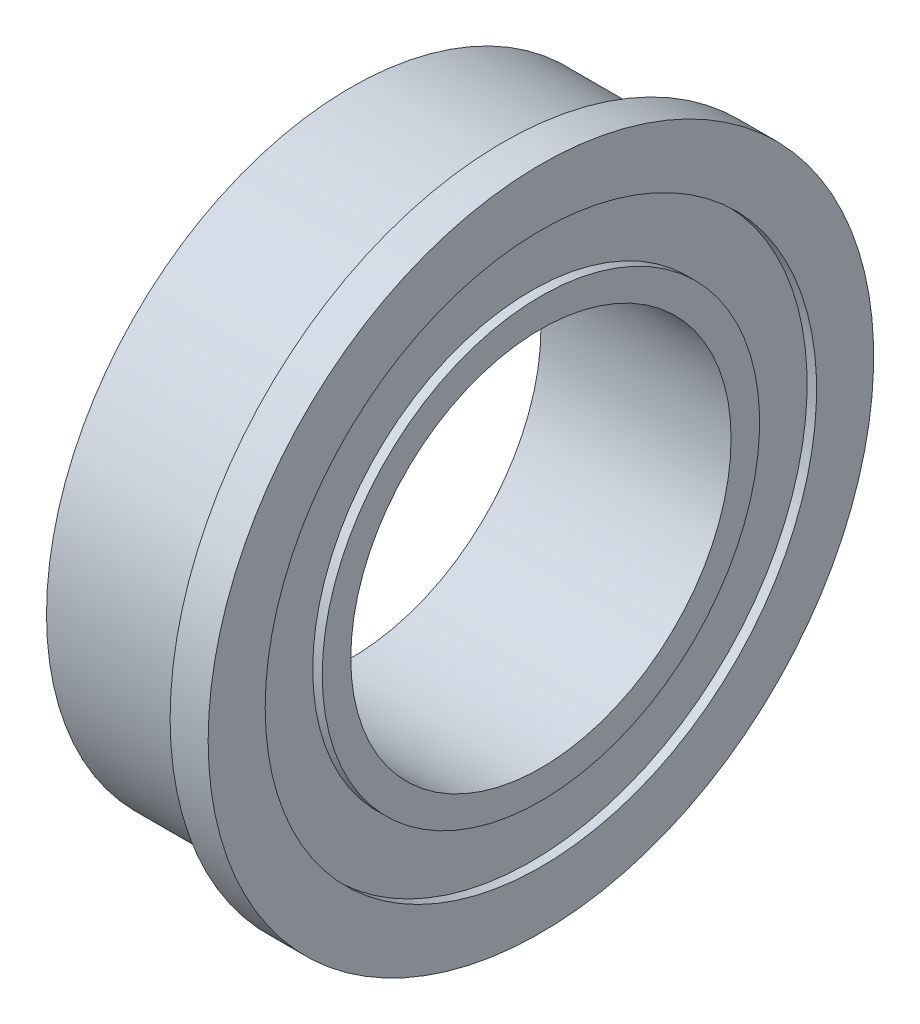
ISO-10303-21;
HEADER;
FILE_DESCRIPTION(('STEP AP214'),'2;1');
FILE_NAME('part.step','',(''),(''),'','','');
FILE_SCHEMA(('AUTOMOTIVE_DESIGN { 1 0 10303 214 1 1 1 1 }'));
ENDSEC;
DATA;
#1=APPLICATION_CONTEXT('core data for automotive mechanical design processes');
#2=APPLICATION_PROTOCOL_DEFINITION('international standard','automotive_design',2000,#1);
#3=PRODUCT_CONTEXT('',#1,'mechanical');
#4=PRODUCT('Part','Part','',(#3));
#5=PRODUCT_RELATED_PRODUCT_CATEGORY('part','',(#4));
#6=PRODUCT_DEFINITION_FORMATION('','',#4);
#7=PRODUCT_DEFINITION_CONTEXT('part definition',#1,'design');
#8=PRODUCT_DEFINITION('design','',#6,#7);
#9=PRODUCT_DEFINITION_SHAPE('','',#8);
#10=(LENGTH_UNIT() NAMED_UNIT(*) SI_UNIT(.MILLI.,.METRE.));
#11=(NAMED_UNIT(*) PLANE_ANGLE_UNIT() SI_UNIT($,.RADIAN.));
#12=(NAMED_UNIT(*) SI_UNIT($,.STERADIAN.) SOLID_ANGLE_UNIT());
#13=UNCERTAINTY_MEASURE_WITH_UNIT(LENGTH_MEASURE(1.E-05),#10,'distance_accuracy_value','');
#14=(GEOMETRIC_REPRESENTATION_CONTEXT(3) GLOBAL_UNCERTAINTY_ASSIGNED_CONTEXT((#13)) GLOBAL_UNIT_ASSIGNED_CONTEXT((#10,
#11,#12)) REPRESENTATION_CONTEXT('',''));
#15=CARTESIAN_POINT('',(0.,0.,0.));
#16=DIRECTION('',(0.,0.,1.));
#17=DIRECTION('',(1.,0.,0.));
#18=AXIS2_PLACEMENT_3D('',#15,#16,#17);
#19=CARTESIAN_POINT('',(0.5,0.,0.));
#20=DIRECTION('',(-1.,0.,0.));
#21=DIRECTION('',(0.,0.,1.));
#22=AXIS2_PLACEMENT_3D('',#19,#20,#21);
#23=PLANE('',#22);
#24=CARTESIAN_POINT('',(0.5,0.,0.));
#25=DIRECTION('',(-1.,0.,0.));
#26=DIRECTION('',(0.,0.,1.));
#27=AXIS2_PLACEMENT_3D('',#24,#25,#26);
#28=CIRCLE('',#27,14.5);
#29=CARTESIAN_POINT('',(0.5,0.,14.5));
#30=VERTEX_POINT('',#29);
#31=EDGE_CURVE('E96',#30,#30,#28,.T.);
#32=ORIENTED_EDGE('',*,*,#31,.T.);
#33=EDGE_LOOP('',(#32));
#34=FACE_BOUND('',#33,.T.);
#35=CARTESIAN_POINT('',(0.5,0.,0.));
#36=DIRECTION('',(-1.,0.,0.));
#37=DIRECTION('',(0.,0.,1.));
#38=AXIS2_PLACEMENT_3D('',#35,#36,#37);
#39=CIRCLE('',#38,11.5);
#40=CARTESIAN_POINT('',(0.5,0.,11.5));
#41=VERTEX_POINT('',#40);
#42=EDGE_CURVE('E10',#41,#41,#39,.T.);
#43=ORIENTED_EDGE('',*,*,#42,.F.);
#44=EDGE_LOOP('',(#43));
#45=FACE_BOUND('',#44,.T.);
#46=ADVANCED_FACE('F37',(#34,#45),#23,.T.);
#47=CARTESIAN_POINT('',(0.,0.,0.));
#48=DIRECTION('',(-1.,0.,0.));
#49=DIRECTION('',(0.,0.,1.));
#50=AXIS2_PLACEMENT_3D('',#47,#48,#49);
#51=CYLINDRICAL_SURFACE('',#50,11.5);
#52=ORIENTED_EDGE('',*,*,#42,.T.);
#53=EDGE_LOOP('',(#52));
#54=FACE_BOUND('',#53,.T.);
#55=CARTESIAN_POINT('',(0.,0.,0.));
#56=DIRECTION('',(-1.,0.,0.));
#57=DIRECTION('',(0.,0.,1.));
#58=AXIS2_PLACEMENT_3D('',#55,#56,#57);
#59=CIRCLE('',#58,11.5);
#60=CARTESIAN_POINT('',(0.,0.,11.5));
#61=VERTEX_POINT('',#60);
#62=EDGE_CURVE('E44',#61,#61,#59,.T.);
#63=ORIENTED_EDGE('',*,*,#62,.F.);
#64=EDGE_LOOP('',(#63));
#65=FACE_BOUND('',#64,.T.);
#66=ADVANCED_FACE('F152',(#54,#65),#51,.T.);
#67=CARTESIAN_POINT('',(0.,0.,0.));
#68=DIRECTION('',(1.,0.,0.));
#69=DIRECTION('',(0.,0.,-1.));
#70=AXIS2_PLACEMENT_3D('',#67,#68,#69);
#71=PLANE('',#70);
#72=CARTESIAN_POINT('',(0.,0.,0.));
#73=DIRECTION('',(-1.,0.,0.));
#74=DIRECTION('',(0.,0.,1.));
#75=AXIS2_PLACEMENT_3D('',#72,#73,#74);
#76=CIRCLE('',#75,10.);
#77=CARTESIAN_POINT('',(0.,0.,10.));
#78=VERTEX_POINT('',#77);
#79=EDGE_CURVE('E49',#78,#78,#76,.T.);
#80=ORIENTED_EDGE('',*,*,#79,.F.);
#81=EDGE_LOOP('',(#80));
#82=FACE_BOUND('',#81,.T.);
#83=ORIENTED_EDGE('',*,*,#62,.T.);
#84=EDGE_LOOP('',(#83));
#85=FACE_BOUND('',#84,.T.);
#86=ADVANCED_FACE('F156',(#82,#85),#71,.F.);
#87=CARTESIAN_POINT('',(0.,0.,0.));
#88=DIRECTION('',(-1.,0.,0.));
#89=DIRECTION('',(0.,0.,1.));
#90=AXIS2_PLACEMENT_3D('',#87,#88,#89);
#91=CYLINDRICAL_SURFACE('',#90,10.);
#92=ORIENTED_EDGE('',*,*,#79,.T.);
#93=EDGE_LOOP('',(#92));
#94=FACE_BOUND('',#93,.T.);
#95=CARTESIAN_POINT('',(10.,0.,0.));
#96=DIRECTION('',(-1.,0.,0.));
#97=DIRECTION('',(0.,0.,1.));
#98=AXIS2_PLACEMENT_3D('',#95,#96,#97);
#99=CIRCLE('',#98,10.);
#100=CARTESIAN_POINT('',(10.,0.,10.));
#101=VERTEX_POINT('',#100);
#102=EDGE_CURVE('E54',#101,#101,#99,.T.);
#103=ORIENTED_EDGE('',*,*,#102,.F.);
#104=EDGE_LOOP('',(#103));
#105=FACE_BOUND('',#104,.T.);
#106=ADVANCED_FACE('F160',(#94,#105),#91,.F.);
#107=CARTESIAN_POINT('',(10.,0.,0.));
#108=DIRECTION('',(-1.,0.,0.));
#109=DIRECTION('',(0.,0.,1.));
#110=AXIS2_PLACEMENT_3D('',#107,#108,#109);
#111=PLANE('',#110);
#112=CARTESIAN_POINT('',(10.,0.,0.));
#113=DIRECTION('',(-1.,0.,0.));
#114=DIRECTION('',(0.,0.,1.));
#115=AXIS2_PLACEMENT_3D('',#112,#113,#114);
#116=CIRCLE('',#115,11.5);
#117=CARTESIAN_POINT('',(10.,0.,11.5));
#118=VERTEX_POINT('',#117);
#119=EDGE_CURVE('E60',#118,#118,#116,.T.);
#120=ORIENTED_EDGE('',*,*,#119,.F.);
#121=EDGE_LOOP('',(#120));
#122=FACE_BOUND('',#121,.T.);
#123=ORIENTED_EDGE('',*,*,#102,.T.);
#124=EDGE_LOOP('',(#123));
#125=FACE_BOUND('',#124,.T.);
#126=ADVANCED_FACE('F138',(#122,#125),#111,.F.);
#127=CARTESIAN_POINT('',(0.,0.,0.));
#128=DIRECTION('',(-1.,0.,0.));
#129=DIRECTION('',(0.,0.,1.));
#130=AXIS2_PLACEMENT_3D('',#127,#128,#129);
#131=CYLINDRICAL_SURFACE('',#130,11.5);
#132=CARTESIAN_POINT('',(9.5,0.,0.));
#133=DIRECTION('',(-1.,0.,0.));
#134=DIRECTION('',(0.,0.,1.));
#135=AXIS2_PLACEMENT_3D('',#132,#133,#134);
#136=CIRCLE('',#135,11.5);
#137=CARTESIAN_POINT('',(9.5,0.,11.5));
#138=VERTEX_POINT('',#137);
#139=EDGE_CURVE('E64',#138,#138,#136,.T.);
#140=ORIENTED_EDGE('',*,*,#139,.F.);
#141=EDGE_LOOP('',(#140));
#142=FACE_BOUND('',#141,.T.);
#143=ORIENTED_EDGE('',*,*,#119,.T.);
#144=EDGE_LOOP('',(#143));
#145=FACE_BOUND('',#144,.T.);
#146=ADVANCED_FACE('F148',(#142,#145),#131,.T.);
#147=CARTESIAN_POINT('',(9.5,0.,0.));
#148=DIRECTION('',(-1.,0.,0.));
#149=DIRECTION('',(0.,0.,1.));
#150=AXIS2_PLACEMENT_3D('',#147,#148,#149);
#151=PLANE('',#150);
#152=CARTESIAN_POINT('',(9.5,0.,0.));
#153=DIRECTION('',(-1.,0.,0.));
#154=DIRECTION('',(0.,0.,1.));
#155=AXIS2_PLACEMENT_3D('',#152,#153,#154);
#156=CIRCLE('',#155,14.5);
#157=CARTESIAN_POINT('',(9.5,0.,14.5));
#158=VERTEX_POINT('',#157);
#159=EDGE_CURVE('E68',#158,#158,#156,.T.);
#160=ORIENTED_EDGE('',*,*,#159,.F.);
#161=EDGE_LOOP('',(#160));
#162=FACE_BOUND('',#161,.T.);
#163=ORIENTED_EDGE('',*,*,#139,.T.);
#164=EDGE_LOOP('',(#163));
#165=FACE_BOUND('',#164,.T.);
#166=ADVANCED_FACE('F142',(#162,#165),#151,.F.);
#167=CARTESIAN_POINT('',(0.,0.,0.));
#168=DIRECTION('',(-1.,0.,0.));
#169=DIRECTION('',(0.,0.,1.));
#170=AXIS2_PLACEMENT_3D('',#167,#168,#169);
#171=CYLINDRICAL_SURFACE('',#170,14.5);
#172=ORIENTED_EDGE('',*,*,#159,.T.);
#173=EDGE_LOOP('',(#172));
#174=FACE_BOUND('',#173,.T.);
#175=CARTESIAN_POINT('',(10.,0.,0.));
#176=DIRECTION('',(-1.,0.,0.));
#177=DIRECTION('',(0.,0.,1.));
#178=AXIS2_PLACEMENT_3D('',#175,#176,#177);
#179=CIRCLE('',#178,14.5);
#180=CARTESIAN_POINT('',(10.,0.,14.5));
#181=VERTEX_POINT('',#180);
#182=EDGE_CURVE('E72',#181,#181,#179,.T.);
#183=ORIENTED_EDGE('',*,*,#182,.F.);
#184=EDGE_LOOP('',(#183));
#185=FACE_BOUND('',#184,.T.);
#186=ADVANCED_FACE('F136',(#174,#185),#171,.F.);
#187=CARTESIAN_POINT('',(10.,0.,0.));
#188=DIRECTION('',(-1.,0.,0.));
#189=DIRECTION('',(0.,0.,1.));
#190=AXIS2_PLACEMENT_3D('',#187,#188,#189);
#191=CIRCLE('',#190,17.5);
#192=CARTESIAN_POINT('',(10.,0.,17.5));
#193=VERTEX_POINT('',#192);
#194=EDGE_CURVE('E76',#193,#193,#191,.T.);
#195=ORIENTED_EDGE('',*,*,#194,.F.);
#196=EDGE_LOOP('',(#195));
#197=FACE_BOUND('',#196,.T.);
#198=ORIENTED_EDGE('',*,*,#182,.T.);
#199=EDGE_LOOP('',(#198));
#200=FACE_BOUND('',#199,.T.);
#201=ADVANCED_FACE('F130',(#197,#200),#111,.F.);
#202=CARTESIAN_POINT('',(0.,0.,0.));
#203=DIRECTION('',(-1.,0.,0.));
#204=DIRECTION('',(0.,0.,1.));
#205=AXIS2_PLACEMENT_3D('',#202,#203,#204);
#206=CYLINDRICAL_SURFACE('',#205,17.5);
#207=CARTESIAN_POINT('',(8.,0.,0.));
#208=DIRECTION('',(-1.,0.,0.));
#209=DIRECTION('',(0.,0.,1.));
#210=AXIS2_PLACEMENT_3D('',#207,#208,#209);
#211=CIRCLE('',#210,17.5);
#212=CARTESIAN_POINT('',(8.,0.,17.5));
#213=VERTEX_POINT('',#212);
#214=EDGE_CURVE('E80',#213,#213,#211,.T.);
#215=ORIENTED_EDGE('',*,*,#214,.F.);
#216=EDGE_LOOP('',(#215));
#217=FACE_BOUND('',#216,.T.);
#218=ORIENTED_EDGE('',*,*,#194,.T.);
#219=EDGE_LOOP('',(#218));
#220=FACE_BOUND('',#219,.T.);
#221=ADVANCED_FACE('F124',(#217,#220),#206,.T.);
#222=CARTESIAN_POINT('',(8.,0.,0.));
#223=DIRECTION('',(1.,0.,0.));
#224=DIRECTION('',(0.,0.,-1.));
#225=AXIS2_PLACEMENT_3D('',#222,#223,#224);
#226=PLANE('',#225);
#227=CARTESIAN_POINT('',(8.,0.,0.));
#228=DIRECTION('',(-1.,0.,0.));
#229=DIRECTION('',(0.,0.,1.));
#230=AXIS2_PLACEMENT_3D('',#227,#228,#229);
#231=CIRCLE('',#230,16.);
#232=CARTESIAN_POINT('',(8.,0.,16.));
#233=VERTEX_POINT('',#232);
#234=EDGE_CURVE('E84',#233,#233,#231,.T.);
#235=ORIENTED_EDGE('',*,*,#234,.F.);
#236=EDGE_LOOP('',(#235));
#237=FACE_BOUND('',#236,.T.);
#238=ORIENTED_EDGE('',*,*,#214,.T.);
#239=EDGE_LOOP('',(#238));
#240=FACE_BOUND('',#239,.T.);
#241=ADVANCED_FACE('F118',(#237,#240),#226,.F.);
#242=CARTESIAN_POINT('',(0.,0.,0.));
#243=DIRECTION('',(-1.,0.,0.));
#244=DIRECTION('',(0.,0.,1.));
#245=AXIS2_PLACEMENT_3D('',#242,#243,#244);
#246=CYLINDRICAL_SURFACE('',#245,16.);
#247=CARTESIAN_POINT('',(0.,0.,0.));
#248=DIRECTION('',(-1.,0.,0.));
#249=DIRECTION('',(0.,0.,1.));
#250=AXIS2_PLACEMENT_3D('',#247,#248,#249);
#251=CIRCLE('',#250,16.);
#252=CARTESIAN_POINT('',(0.,0.,16.));
#253=VERTEX_POINT('',#252);
#254=EDGE_CURVE('E88',#253,#253,#251,.T.);
#255=ORIENTED_EDGE('',*,*,#254,.F.);
#256=EDGE_LOOP('',(#255));
#257=FACE_BOUND('',#256,.T.);
#258=ORIENTED_EDGE('',*,*,#234,.T.);
#259=EDGE_LOOP('',(#258));
#260=FACE_BOUND('',#259,.T.);
#261=ADVANCED_FACE('F112',(#257,#260),#246,.T.);
#262=CARTESIAN_POINT('',(0.,0.,0.));
#263=DIRECTION('',(1.,0.,0.));
#264=DIRECTION('',(0.,0.,-1.));
#265=AXIS2_PLACEMENT_3D('',#262,#263,#264);
#266=PLANE('',#265);
#267=CARTESIAN_POINT('',(0.,0.,0.));
#268=DIRECTION('',(-1.,0.,0.));
#269=DIRECTION('',(0.,0.,1.));
#270=AXIS2_PLACEMENT_3D('',#267,#268,#269);
#271=CIRCLE('',#270,14.5);
#272=CARTESIAN_POINT('',(0.,0.,14.5));
#273=VERTEX_POINT('',#272);
#274=EDGE_CURVE('E92',#273,#273,#271,.T.);
#275=ORIENTED_EDGE('',*,*,#274,.F.);
#276=EDGE_LOOP('',(#275));
#277=FACE_BOUND('',#276,.T.);
#278=ORIENTED_EDGE('',*,*,#254,.T.);
#279=EDGE_LOOP('',(#278));
#280=FACE_BOUND('',#279,.T.);
#281=ADVANCED_FACE('F106',(#277,#280),#266,.F.);
#282=CARTESIAN_POINT('',(0.,0.,0.));
#283=DIRECTION('',(-1.,0.,0.));
#284=DIRECTION('',(0.,0.,1.));
#285=AXIS2_PLACEMENT_3D('',#282,#283,#284);
#286=CYLINDRICAL_SURFACE('',#285,14.5);
#287=ORIENTED_EDGE('',*,*,#31,.F.);
#288=EDGE_LOOP('',(#287));
#289=FACE_BOUND('',#288,.T.);
#290=ORIENTED_EDGE('',*,*,#274,.T.);
#291=EDGE_LOOP('',(#290));
#292=FACE_BOUND('',#291,.T.);
#293=ADVANCED_FACE('F103',(#289,#292),#286,.F.);
#294=CLOSED_SHELL('',(#46,#66,#86,#106,#126,#146,#166,#186,#201,#221,#241,#261,#281,#293));
#295=MANIFOLD_SOLID_BREP('B2',#294);
#296=ADVANCED_BREP_SHAPE_REPRESENTATION('',(#18,#295),#14);
#297=SHAPE_DEFINITION_REPRESENTATION(#9,#296);
ENDSEC;
END-ISO-10303-21;
